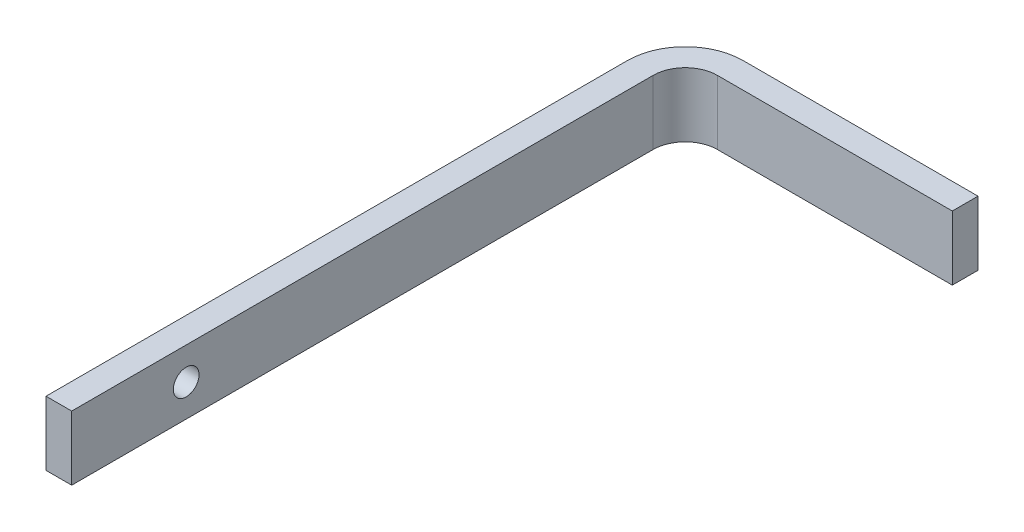
ISO-10303-21;
HEADER;
FILE_DESCRIPTION(('STEP AP214'),'2;1');
FILE_NAME('part.step','',(''),(''),'','','');
FILE_SCHEMA(('AUTOMOTIVE_DESIGN { 1 0 10303 214 1 1 1 1 }'));
ENDSEC;
DATA;
#1=APPLICATION_CONTEXT('core data for automotive mechanical design processes');
#2=APPLICATION_PROTOCOL_DEFINITION('international standard','automotive_design',2000,#1);
#3=PRODUCT_CONTEXT('',#1,'mechanical');
#4=PRODUCT('Part','Part','',(#3));
#5=PRODUCT_RELATED_PRODUCT_CATEGORY('part','',(#4));
#6=PRODUCT_DEFINITION_FORMATION('','',#4);
#7=PRODUCT_DEFINITION_CONTEXT('part definition',#1,'design');
#8=PRODUCT_DEFINITION('design','',#6,#7);
#9=PRODUCT_DEFINITION_SHAPE('','',#8);
#10=(LENGTH_UNIT() NAMED_UNIT(*) SI_UNIT(.MILLI.,.METRE.));
#11=(NAMED_UNIT(*) PLANE_ANGLE_UNIT() SI_UNIT($,.RADIAN.));
#12=(NAMED_UNIT(*) SI_UNIT($,.STERADIAN.) SOLID_ANGLE_UNIT());
#13=UNCERTAINTY_MEASURE_WITH_UNIT(LENGTH_MEASURE(1.E-05),#10,'distance_accuracy_value','');
#14=(GEOMETRIC_REPRESENTATION_CONTEXT(3) GLOBAL_UNCERTAINTY_ASSIGNED_CONTEXT((#13)) GLOBAL_UNIT_ASSIGNED_CONTEXT((#10,
#11,#12)) REPRESENTATION_CONTEXT('',''));
#15=CARTESIAN_POINT('',(0.,0.,0.));
#16=DIRECTION('',(0.,0.,1.));
#17=DIRECTION('',(1.,0.,0.));
#18=AXIS2_PLACEMENT_3D('',#15,#16,#17);
#19=CARTESIAN_POINT('',(217.879751124336,-214.825535437862,-810.417474515386));
#20=DIRECTION('',(0.,-1.,0.));
#21=DIRECTION('',(1.,0.,0.));
#22=AXIS2_PLACEMENT_3D('',#19,#20,#21);
#23=CYLINDRICAL_SURFACE('',#22,9.00000000000002);
#24=DIRECTION('',(0.,1.,0.));
#25=VECTOR('',#24,1.);
#26=CARTESIAN_POINT('',(208.879751124336,-219.825535437862,-810.417474515385));
#27=LINE('',#26,#25);
#28=CARTESIAN_POINT('',(208.879751124336,-224.825535437862,-810.417474515385));
#29=VERTEX_POINT('',#28);
#30=CARTESIAN_POINT('',(208.879751124336,-214.825535437862,-810.417474515385));
#31=VERTEX_POINT('',#30);
#32=EDGE_CURVE('E136',#29,#31,#27,.T.);
#33=ORIENTED_EDGE('',*,*,#32,.T.);
#34=CARTESIAN_POINT('',(217.879751124336,-214.825535437862,-810.417474515386));
#35=DIRECTION('',(0.,-1.,0.));
#36=DIRECTION('',(1.,0.,0.));
#37=AXIS2_PLACEMENT_3D('',#34,#35,#36);
#38=CIRCLE('',#37,9.00000000000002);
#39=CARTESIAN_POINT('',(217.879751124341,-214.825535437862,-819.417474515387));
#40=VERTEX_POINT('',#39);
#41=EDGE_CURVE('E165',#31,#40,#38,.T.);
#42=ORIENTED_EDGE('',*,*,#41,.T.);
#43=DIRECTION('',(0.,1.,0.));
#44=VECTOR('',#43,1.);
#45=CARTESIAN_POINT('',(217.879751124347,-219.825535437862,-819.417474515388));
#46=LINE('',#45,#44);
#47=CARTESIAN_POINT('',(217.879751124341,-224.825535437862,-819.417474515388));
#48=VERTEX_POINT('',#47);
#49=EDGE_CURVE('E66',#40,#48,#46,.F.);
#50=ORIENTED_EDGE('',*,*,#49,.T.);
#51=CARTESIAN_POINT('',(217.879751124336,-224.825535437862,-810.417474515386));
#52=DIRECTION('',(0.,-1.,0.));
#53=DIRECTION('',(1.,0.,0.));
#54=AXIS2_PLACEMENT_3D('',#51,#52,#53);
#55=CIRCLE('',#54,9.00000000000002);
#56=EDGE_CURVE('E20',#48,#29,#55,.F.);
#57=ORIENTED_EDGE('',*,*,#56,.T.);
#58=EDGE_LOOP('',(#33,#42,#50,#57));
#59=FACE_BOUND('',#58,.T.);
#60=ADVANCED_FACE('F17',(#59),#23,.T.);
#61=CARTESIAN_POINT('',(179.520154002007,-219.825535437862,-819.417474515388));
#62=DIRECTION('',(0.,0.,1.));
#63=DIRECTION('',(1.,0.,0.));
#64=AXIS2_PLACEMENT_3D('',#61,#62,#63);
#65=PLANE('',#64);
#66=DIRECTION('',(1.,0.,0.));
#67=VECTOR('',#66,1.);
#68=CARTESIAN_POINT('',(210.879751124336,-214.825535437862,-819.417474515386));
#69=LINE('',#68,#67);
#70=CARTESIAN_POINT('',(254.446280072505,-214.825535437862,-819.417474515387));
#71=VERTEX_POINT('',#70);
#72=EDGE_CURVE('E149',#40,#71,#69,.T.);
#73=ORIENTED_EDGE('',*,*,#72,.T.);
#74=DIRECTION('',(0.,-1.,0.));
#75=VECTOR('',#74,1.);
#76=CARTESIAN_POINT('',(254.446280072505,-201.239072168841,-819.417474515388));
#77=LINE('',#76,#75);
#78=CARTESIAN_POINT('',(254.446280072505,-224.825535437862,-819.417474515388));
#79=VERTEX_POINT('',#78);
#80=EDGE_CURVE('E76',#71,#79,#77,.T.);
#81=ORIENTED_EDGE('',*,*,#80,.T.);
#82=DIRECTION('',(-1.,0.,0.));
#83=VECTOR('',#82,1.);
#84=CARTESIAN_POINT('',(210.879751124336,-224.825535437862,-819.417474515388));
#85=LINE('',#84,#83);
#86=EDGE_CURVE('E128',#79,#48,#85,.T.);
#87=ORIENTED_EDGE('',*,*,#86,.T.);
#88=ORIENTED_EDGE('',*,*,#49,.F.);
#89=EDGE_LOOP('',(#73,#81,#87,#88));
#90=FACE_BOUND('',#89,.T.);
#91=ADVANCED_FACE('F191',(#90),#65,.F.);
#92=CARTESIAN_POINT('',(254.446280072505,-201.239072168841,-834.765523527915));
#93=DIRECTION('',(-1.,0.,0.));
#94=DIRECTION('',(0.,-1.,0.));
#95=AXIS2_PLACEMENT_3D('',#92,#93,#94);
#96=PLANE('',#95);
#97=DIRECTION('',(0.,0.,1.));
#98=VECTOR('',#97,1.);
#99=CARTESIAN_POINT('',(254.446280072505,-214.825535437862,-779.911859027033));
#100=LINE('',#99,#98);
#101=CARTESIAN_POINT('',(254.446280072505,-214.825535437862,-815.417474515386));
#102=VERTEX_POINT('',#101);
#103=EDGE_CURVE('E145',#71,#102,#100,.T.);
#104=ORIENTED_EDGE('',*,*,#103,.T.);
#105=DIRECTION('',(0.,1.,0.));
#106=VECTOR('',#105,1.);
#107=CARTESIAN_POINT('',(254.446280072505,-219.825535437862,-815.417474515386));
#108=LINE('',#107,#106);
#109=CARTESIAN_POINT('',(254.446280072505,-224.825535437862,-815.417474515386));
#110=VERTEX_POINT('',#109);
#111=EDGE_CURVE('E141',#102,#110,#108,.F.);
#112=ORIENTED_EDGE('',*,*,#111,.T.);
#113=DIRECTION('',(0.,0.,1.));
#114=VECTOR('',#113,1.);
#115=CARTESIAN_POINT('',(254.446280072505,-224.825535437862,-779.911859027033));
#116=LINE('',#115,#114);
#117=EDGE_CURVE('E130',#110,#79,#116,.F.);
#118=ORIENTED_EDGE('',*,*,#117,.T.);
#119=ORIENTED_EDGE('',*,*,#80,.F.);
#120=EDGE_LOOP('',(#104,#112,#118,#119));
#121=FACE_BOUND('',#120,.T.);
#122=ADVANCED_FACE('F193',(#121),#96,.F.);
#123=CARTESIAN_POINT('',(179.520154002007,-219.825535437862,-815.417474515386));
#124=DIRECTION('',(0.,0.,-1.));
#125=DIRECTION('',(-1.,0.,0.));
#126=AXIS2_PLACEMENT_3D('',#123,#124,#125);
#127=PLANE('',#126);
#128=DIRECTION('',(-1.,0.,0.));
#129=VECTOR('',#128,1.);
#130=CARTESIAN_POINT('',(210.879751124336,-224.825535437862,-815.417474515386));
#131=LINE('',#130,#129);
#132=CARTESIAN_POINT('',(217.879751124336,-224.825535437862,-815.417474515386));
#133=VERTEX_POINT('',#132);
#134=EDGE_CURVE('E133',#133,#110,#131,.F.);
#135=ORIENTED_EDGE('',*,*,#134,.T.);
#136=ORIENTED_EDGE('',*,*,#111,.F.);
#137=DIRECTION('',(1.,0.,0.));
#138=VECTOR('',#137,1.);
#139=CARTESIAN_POINT('',(210.879751124336,-214.825535437862,-815.417474515386));
#140=LINE('',#139,#138);
#141=CARTESIAN_POINT('',(217.879751124336,-214.825535437862,-815.417474515386));
#142=VERTEX_POINT('',#141);
#143=EDGE_CURVE('E148',#102,#142,#140,.F.);
#144=ORIENTED_EDGE('',*,*,#143,.T.);
#145=DIRECTION('',(0.,-1.,0.));
#146=VECTOR('',#145,1.);
#147=CARTESIAN_POINT('',(217.879751124336,-214.825535437862,-815.417474515386));
#148=LINE('',#147,#146);
#149=EDGE_CURVE('E117',#142,#133,#148,.T.);
#150=ORIENTED_EDGE('',*,*,#149,.T.);
#151=EDGE_LOOP('',(#135,#136,#144,#150));
#152=FACE_BOUND('',#151,.T.);
#153=ADVANCED_FACE('F196',(#152),#127,.F.);
#154=CARTESIAN_POINT('',(208.879751124336,-219.825535437862,-779.911859027033));
#155=DIRECTION('',(1.,0.,0.));
#156=DIRECTION('',(0.,1.,0.));
#157=AXIS2_PLACEMENT_3D('',#154,#155,#156);
#158=PLANE('',#157);
#159=CARTESIAN_POINT('',(208.879751124336,-219.825535437862,-737.73212277495));
#160=DIRECTION('',(-1.,0.,0.));
#161=DIRECTION('',(0.,-1.,0.));
#162=AXIS2_PLACEMENT_3D('',#159,#160,#161);
#163=CIRCLE('',#162,2.);
#164=CARTESIAN_POINT('',(208.879751124336,-221.825535437862,-737.73212277495));
#165=VERTEX_POINT('',#164);
#166=EDGE_CURVE('E114',#165,#165,#163,.F.);
#167=ORIENTED_EDGE('',*,*,#166,.T.);
#168=EDGE_LOOP('',(#167));
#169=FACE_BOUND('',#168,.T.);
#170=DIRECTION('',(0.,0.,1.));
#171=VECTOR('',#170,1.);
#172=CARTESIAN_POINT('',(208.879751124336,-224.825535437862,-779.911859027033));
#173=LINE('',#172,#171);
#174=CARTESIAN_POINT('',(208.879751124336,-224.825535437862,-719.911859027032));
#175=VERTEX_POINT('',#174);
#176=EDGE_CURVE('E124',#29,#175,#173,.T.);
#177=ORIENTED_EDGE('',*,*,#176,.T.);
#178=DIRECTION('',(0.,1.,0.));
#179=VECTOR('',#178,1.);
#180=CARTESIAN_POINT('',(208.879751124336,-219.825535437862,-719.911859027032));
#181=LINE('',#180,#179);
#182=CARTESIAN_POINT('',(208.879751124336,-214.825535437862,-719.911859027032));
#183=VERTEX_POINT('',#182);
#184=EDGE_CURVE('E96',#183,#175,#181,.F.);
#185=ORIENTED_EDGE('',*,*,#184,.F.);
#186=DIRECTION('',(0.,0.,1.));
#187=VECTOR('',#186,1.);
#188=CARTESIAN_POINT('',(208.879751124336,-214.825535437862,-779.911859027033));
#189=LINE('',#188,#187);
#190=EDGE_CURVE('E166',#183,#31,#189,.F.);
#191=ORIENTED_EDGE('',*,*,#190,.T.);
#192=ORIENTED_EDGE('',*,*,#32,.F.);
#193=EDGE_LOOP('',(#177,#185,#191,#192));
#194=FACE_BOUND('',#193,.T.);
#195=ADVANCED_FACE('F252',(#169,#194),#158,.F.);
#196=CARTESIAN_POINT('',(210.879751124336,-224.825535437862,-779.911859027033));
#197=DIRECTION('',(0.,1.,0.));
#198=DIRECTION('',(-1.,0.,0.));
#199=AXIS2_PLACEMENT_3D('',#196,#197,#198);
#200=PLANE('',#199);
#201=ORIENTED_EDGE('',*,*,#56,.F.);
#202=ORIENTED_EDGE('',*,*,#86,.F.);
#203=ORIENTED_EDGE('',*,*,#117,.F.);
#204=ORIENTED_EDGE('',*,*,#134,.F.);
#205=CARTESIAN_POINT('',(217.879751124336,-224.825535437862,-810.417474515386));
#206=DIRECTION('',(0.,-1.,0.));
#207=DIRECTION('',(1.,0.,0.));
#208=AXIS2_PLACEMENT_3D('',#205,#206,#207);
#209=CIRCLE('',#208,4.99999999999999);
#210=CARTESIAN_POINT('',(212.879751124336,-224.825535437862,-810.417474515386));
#211=VERTEX_POINT('',#210);
#212=EDGE_CURVE('E113',#133,#211,#209,.F.);
#213=ORIENTED_EDGE('',*,*,#212,.T.);
#214=DIRECTION('',(0.,0.,1.));
#215=VECTOR('',#214,1.);
#216=CARTESIAN_POINT('',(212.879751124336,-224.825535437862,-779.911859027033));
#217=LINE('',#216,#215);
#218=CARTESIAN_POINT('',(212.879751124336,-224.825535437862,-719.911859027032));
#219=VERTEX_POINT('',#218);
#220=EDGE_CURVE('E106',#211,#219,#217,.T.);
#221=ORIENTED_EDGE('',*,*,#220,.T.);
#222=DIRECTION('',(1.,0.,0.));
#223=VECTOR('',#222,1.);
#224=CARTESIAN_POINT('',(210.879751124336,-224.825535437862,-719.911859027032));
#225=LINE('',#224,#223);
#226=EDGE_CURVE('E91',#175,#219,#225,.T.);
#227=ORIENTED_EDGE('',*,*,#226,.F.);
#228=ORIENTED_EDGE('',*,*,#176,.F.);
#229=EDGE_LOOP('',(#201,#202,#203,#204,#213,#221,#227,#228));
#230=FACE_BOUND('',#229,.T.);
#231=ADVANCED_FACE('F111',(#230),#200,.F.);
#232=CARTESIAN_POINT('',(210.879751124336,-219.825535437862,-719.911859027032));
#233=DIRECTION('',(0.,0.,1.));
#234=DIRECTION('',(1.,0.,0.));
#235=AXIS2_PLACEMENT_3D('',#232,#233,#234);
#236=PLANE('',#235);
#237=DIRECTION('',(0.,-1.,0.));
#238=VECTOR('',#237,1.);
#239=CARTESIAN_POINT('',(212.879751124336,-219.825535437862,-719.911859027032));
#240=LINE('',#239,#238);
#241=CARTESIAN_POINT('',(212.879751124336,-214.825535437862,-719.911859027032));
#242=VERTEX_POINT('',#241);
#243=EDGE_CURVE('E95',#219,#242,#240,.F.);
#244=ORIENTED_EDGE('',*,*,#243,.T.);
#245=DIRECTION('',(1.,0.,0.));
#246=VECTOR('',#245,1.);
#247=CARTESIAN_POINT('',(210.879751124336,-214.825535437862,-719.911859027032));
#248=LINE('',#247,#246);
#249=EDGE_CURVE('E101',#242,#183,#248,.F.);
#250=ORIENTED_EDGE('',*,*,#249,.T.);
#251=ORIENTED_EDGE('',*,*,#184,.T.);
#252=ORIENTED_EDGE('',*,*,#226,.T.);
#253=EDGE_LOOP('',(#244,#250,#251,#252));
#254=FACE_BOUND('',#253,.T.);
#255=ADVANCED_FACE('F93',(#254),#236,.T.);
#256=CARTESIAN_POINT('',(210.879751124336,-214.825535437862,-779.911859027033));
#257=DIRECTION('',(0.,-1.,0.));
#258=DIRECTION('',(1.,0.,0.));
#259=AXIS2_PLACEMENT_3D('',#256,#257,#258);
#260=PLANE('',#259);
#261=CARTESIAN_POINT('',(217.879751124336,-214.825535437862,-810.417474515386));
#262=DIRECTION('',(0.,-1.,0.));
#263=DIRECTION('',(1.,0.,0.));
#264=AXIS2_PLACEMENT_3D('',#261,#262,#263);
#265=CIRCLE('',#264,4.99999999999999);
#266=CARTESIAN_POINT('',(212.879751124336,-214.825535437862,-810.417474515386));
#267=VERTEX_POINT('',#266);
#268=EDGE_CURVE('E35',#267,#142,#265,.T.);
#269=ORIENTED_EDGE('',*,*,#268,.T.);
#270=ORIENTED_EDGE('',*,*,#143,.F.);
#271=ORIENTED_EDGE('',*,*,#103,.F.);
#272=ORIENTED_EDGE('',*,*,#72,.F.);
#273=ORIENTED_EDGE('',*,*,#41,.F.);
#274=ORIENTED_EDGE('',*,*,#190,.F.);
#275=ORIENTED_EDGE('',*,*,#249,.F.);
#276=DIRECTION('',(0.,0.,1.));
#277=VECTOR('',#276,1.);
#278=CARTESIAN_POINT('',(212.879751124336,-214.825535437862,-779.911859027033));
#279=LINE('',#278,#277);
#280=EDGE_CURVE('E109',#242,#267,#279,.F.);
#281=ORIENTED_EDGE('',*,*,#280,.T.);
#282=EDGE_LOOP('',(#269,#270,#271,#272,#273,#274,#275,#281));
#283=FACE_BOUND('',#282,.T.);
#284=ADVANCED_FACE('F187',(#283),#260,.F.);
#285=CARTESIAN_POINT('',(217.879751124336,-214.825535437862,-810.417474515386));
#286=DIRECTION('',(0.,-1.,0.));
#287=DIRECTION('',(1.,0.,0.));
#288=AXIS2_PLACEMENT_3D('',#285,#286,#287);
#289=CYLINDRICAL_SURFACE('',#288,4.99999999999999);
#290=ORIENTED_EDGE('',*,*,#268,.F.);
#291=DIRECTION('',(0.,-1.,0.));
#292=VECTOR('',#291,1.);
#293=CARTESIAN_POINT('',(212.879751124336,-219.825535437862,-810.417474515386));
#294=LINE('',#293,#292);
#295=EDGE_CURVE('E26',#267,#211,#294,.T.);
#296=ORIENTED_EDGE('',*,*,#295,.T.);
#297=ORIENTED_EDGE('',*,*,#212,.F.);
#298=ORIENTED_EDGE('',*,*,#149,.F.);
#299=EDGE_LOOP('',(#290,#296,#297,#298));
#300=FACE_BOUND('',#299,.T.);
#301=ADVANCED_FACE('F197',(#300),#289,.F.);
#302=CARTESIAN_POINT('',(212.879751124336,-219.825535437862,-737.73212277495));
#303=DIRECTION('',(-1.,0.,0.));
#304=DIRECTION('',(0.,-1.,0.));
#305=AXIS2_PLACEMENT_3D('',#302,#303,#304);
#306=CYLINDRICAL_SURFACE('',#305,2.);
#307=ORIENTED_EDGE('',*,*,#166,.F.);
#308=EDGE_LOOP('',(#307));
#309=FACE_BOUND('',#308,.T.);
#310=CARTESIAN_POINT('',(212.879751124336,-219.825535437862,-737.73212277495));
#311=DIRECTION('',(-1.,0.,0.));
#312=DIRECTION('',(0.,-1.,0.));
#313=AXIS2_PLACEMENT_3D('',#310,#311,#312);
#314=CIRCLE('',#313,2.);
#315=CARTESIAN_POINT('',(212.879751124336,-221.825535437862,-737.73212277495));
#316=VERTEX_POINT('',#315);
#317=EDGE_CURVE('E11',#316,#316,#314,.F.);
#318=ORIENTED_EDGE('',*,*,#317,.T.);
#319=EDGE_LOOP('',(#318));
#320=FACE_BOUND('',#319,.T.);
#321=ADVANCED_FACE('F199',(#309,#320),#306,.F.);
#322=CARTESIAN_POINT('',(212.879751124336,-219.825535437862,-779.911859027033));
#323=DIRECTION('',(-1.,0.,0.));
#324=DIRECTION('',(0.,-1.,0.));
#325=AXIS2_PLACEMENT_3D('',#322,#323,#324);
#326=PLANE('',#325);
#327=ORIENTED_EDGE('',*,*,#317,.F.);
#328=EDGE_LOOP('',(#327));
#329=FACE_BOUND('',#328,.T.);
#330=ORIENTED_EDGE('',*,*,#280,.F.);
#331=ORIENTED_EDGE('',*,*,#243,.F.);
#332=ORIENTED_EDGE('',*,*,#220,.F.);
#333=ORIENTED_EDGE('',*,*,#295,.F.);
#334=EDGE_LOOP('',(#330,#331,#332,#333));
#335=FACE_BOUND('',#334,.T.);
#336=ADVANCED_FACE('F105',(#329,#335),#326,.F.);
#337=CLOSED_SHELL('',(#60,#91,#122,#153,#195,#231,#255,#284,#301,#321,#336));
#338=MANIFOLD_SOLID_BREP('B1',#337);
#339=ADVANCED_BREP_SHAPE_REPRESENTATION('',(#18,#338),#14);
#340=SHAPE_DEFINITION_REPRESENTATION(#9,#339);
ENDSEC;
END-ISO-10303-21;
